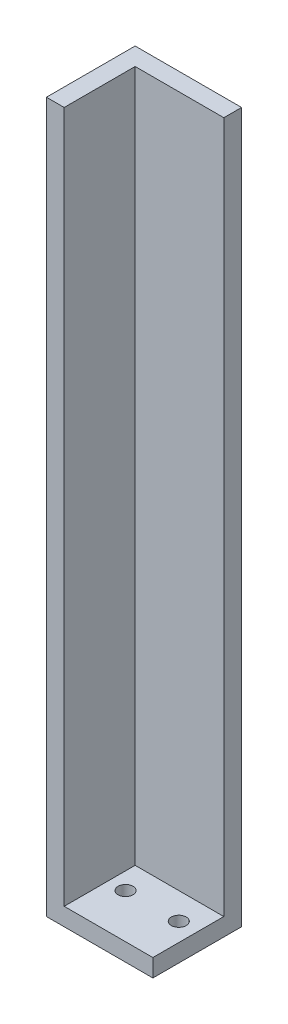
ISO-10303-21;
HEADER;
FILE_DESCRIPTION(('STEP AP214'),'2;1');
FILE_NAME('part.step','',(''),(''),'','','');
FILE_SCHEMA(('AUTOMOTIVE_DESIGN { 1 0 10303 214 1 1 1 1 }'));
ENDSEC;
DATA;
#1=APPLICATION_CONTEXT('core data for automotive mechanical design processes');
#2=APPLICATION_PROTOCOL_DEFINITION('international standard','automotive_design',2000,#1);
#3=PRODUCT_CONTEXT('',#1,'mechanical');
#4=PRODUCT('Part','Part','',(#3));
#5=PRODUCT_RELATED_PRODUCT_CATEGORY('part','',(#4));
#6=PRODUCT_DEFINITION_FORMATION('','',#4);
#7=PRODUCT_DEFINITION_CONTEXT('part definition',#1,'design');
#8=PRODUCT_DEFINITION('design','',#6,#7);
#9=PRODUCT_DEFINITION_SHAPE('','',#8);
#10=(LENGTH_UNIT() NAMED_UNIT(*) SI_UNIT(.MILLI.,.METRE.));
#11=(NAMED_UNIT(*) PLANE_ANGLE_UNIT() SI_UNIT($,.RADIAN.));
#12=(NAMED_UNIT(*) SI_UNIT($,.STERADIAN.) SOLID_ANGLE_UNIT());
#13=UNCERTAINTY_MEASURE_WITH_UNIT(LENGTH_MEASURE(1.E-05),#10,'distance_accuracy_value','');
#14=(GEOMETRIC_REPRESENTATION_CONTEXT(3) GLOBAL_UNCERTAINTY_ASSIGNED_CONTEXT((#13)) GLOBAL_UNIT_ASSIGNED_CONTEXT((#10,
#11,#12)) REPRESENTATION_CONTEXT('',''));
#15=CARTESIAN_POINT('',(0.,0.,0.));
#16=DIRECTION('',(0.,0.,1.));
#17=DIRECTION('',(1.,0.,0.));
#18=AXIS2_PLACEMENT_3D('',#15,#16,#17);
#19=CARTESIAN_POINT('',(30.,200.,25.));
#20=DIRECTION('',(-1.,0.,0.));
#21=DIRECTION('',(0.,0.,1.));
#22=AXIS2_PLACEMENT_3D('',#19,#20,#21);
#23=PLANE('',#22);
#24=DIRECTION('',(0.,1.,0.));
#25=VECTOR('',#24,1.);
#26=CARTESIAN_POINT('',(30.,200.,-15.));
#27=LINE('',#26,#25);
#28=CARTESIAN_POINT('',(30.,-190.,-15.));
#29=VERTEX_POINT('',#28);
#30=CARTESIAN_POINT('',(30.,200.,-15.));
#31=VERTEX_POINT('',#30);
#32=EDGE_CURVE('E51',#29,#31,#27,.T.);
#33=ORIENTED_EDGE('',*,*,#32,.F.);
#34=DIRECTION('',(0.,0.,-1.));
#35=VECTOR('',#34,1.);
#36=CARTESIAN_POINT('',(30.,-190.,25.));
#37=LINE('',#36,#35);
#38=CARTESIAN_POINT('',(30.,-190.,25.));
#39=VERTEX_POINT('',#38);
#40=EDGE_CURVE('E118',#39,#29,#37,.T.);
#41=ORIENTED_EDGE('',*,*,#40,.F.);
#42=DIRECTION('',(0.,-1.,0.));
#43=VECTOR('',#42,1.);
#44=CARTESIAN_POINT('',(30.,200.,25.));
#45=LINE('',#44,#43);
#46=CARTESIAN_POINT('',(30.,-200.,25.));
#47=VERTEX_POINT('',#46);
#48=EDGE_CURVE('E81',#39,#47,#45,.T.);
#49=ORIENTED_EDGE('',*,*,#48,.T.);
#50=DIRECTION('',(0.,0.,-1.));
#51=VECTOR('',#50,1.);
#52=CARTESIAN_POINT('',(30.,-200.,25.));
#53=LINE('',#52,#51);
#54=CARTESIAN_POINT('',(30.,-200.,-25.));
#55=VERTEX_POINT('',#54);
#56=EDGE_CURVE('E133',#47,#55,#53,.T.);
#57=ORIENTED_EDGE('',*,*,#56,.T.);
#58=DIRECTION('',(0.,-1.,0.));
#59=VECTOR('',#58,1.);
#60=CARTESIAN_POINT('',(30.,200.,-25.));
#61=LINE('',#60,#59);
#62=CARTESIAN_POINT('',(30.,200.,-25.));
#63=VERTEX_POINT('',#62);
#64=EDGE_CURVE('E12',#63,#55,#61,.T.);
#65=ORIENTED_EDGE('',*,*,#64,.F.);
#66=DIRECTION('',(0.,0.,-1.));
#67=VECTOR('',#66,1.);
#68=CARTESIAN_POINT('',(30.,200.,25.));
#69=LINE('',#68,#67);
#70=EDGE_CURVE('E86',#31,#63,#69,.T.);
#71=ORIENTED_EDGE('',*,*,#70,.F.);
#72=EDGE_LOOP('',(#33,#41,#49,#57,#65,#71));
#73=FACE_BOUND('',#72,.T.);
#74=ADVANCED_FACE('F35',(#73),#23,.F.);
#75=CARTESIAN_POINT('',(30.,200.,-25.));
#76=DIRECTION('',(0.,0.,1.));
#77=DIRECTION('',(1.,0.,0.));
#78=AXIS2_PLACEMENT_3D('',#75,#76,#77);
#79=PLANE('',#78);
#80=DIRECTION('',(-1.,0.,0.));
#81=VECTOR('',#80,1.);
#82=CARTESIAN_POINT('',(30.,-200.,-25.));
#83=LINE('',#82,#81);
#84=CARTESIAN_POINT('',(-30.,-200.,-25.));
#85=VERTEX_POINT('',#84);
#86=EDGE_CURVE('E143',#55,#85,#83,.T.);
#87=ORIENTED_EDGE('',*,*,#86,.T.);
#88=DIRECTION('',(0.,-1.,0.));
#89=VECTOR('',#88,1.);
#90=CARTESIAN_POINT('',(-30.,200.,-25.));
#91=LINE('',#90,#89);
#92=CARTESIAN_POINT('',(-30.,200.,-25.));
#93=VERTEX_POINT('',#92);
#94=EDGE_CURVE('E43',#93,#85,#91,.T.);
#95=ORIENTED_EDGE('',*,*,#94,.F.);
#96=DIRECTION('',(-1.,0.,0.));
#97=VECTOR('',#96,1.);
#98=CARTESIAN_POINT('',(30.,200.,-25.));
#99=LINE('',#98,#97);
#100=EDGE_CURVE('E135',#63,#93,#99,.T.);
#101=ORIENTED_EDGE('',*,*,#100,.F.);
#102=ORIENTED_EDGE('',*,*,#64,.T.);
#103=EDGE_LOOP('',(#87,#95,#101,#102));
#104=FACE_BOUND('',#103,.T.);
#105=ADVANCED_FACE('F187',(#104),#79,.F.);
#106=CARTESIAN_POINT('',(-30.,200.,25.));
#107=DIRECTION('',(-1.,0.,0.));
#108=DIRECTION('',(0.,0.,1.));
#109=AXIS2_PLACEMENT_3D('',#106,#107,#108);
#110=PLANE('',#109);
#111=DIRECTION('',(0.,0.,-1.));
#112=VECTOR('',#111,1.);
#113=CARTESIAN_POINT('',(-30.,-200.,25.));
#114=LINE('',#113,#112);
#115=CARTESIAN_POINT('',(-30.,-200.,25.));
#116=VERTEX_POINT('',#115);
#117=EDGE_CURVE('E146',#116,#85,#114,.T.);
#118=ORIENTED_EDGE('',*,*,#117,.F.);
#119=DIRECTION('',(0.,-1.,0.));
#120=VECTOR('',#119,1.);
#121=CARTESIAN_POINT('',(-30.,200.,25.));
#122=LINE('',#121,#120);
#123=CARTESIAN_POINT('',(-30.,200.,25.));
#124=VERTEX_POINT('',#123);
#125=EDGE_CURVE('E152',#124,#116,#122,.T.);
#126=ORIENTED_EDGE('',*,*,#125,.F.);
#127=DIRECTION('',(0.,0.,-1.));
#128=VECTOR('',#127,1.);
#129=CARTESIAN_POINT('',(-30.,200.,25.));
#130=LINE('',#129,#128);
#131=EDGE_CURVE('E138',#124,#93,#130,.T.);
#132=ORIENTED_EDGE('',*,*,#131,.T.);
#133=ORIENTED_EDGE('',*,*,#94,.T.);
#134=EDGE_LOOP('',(#118,#126,#132,#133));
#135=FACE_BOUND('',#134,.T.);
#136=ADVANCED_FACE('F184',(#135),#110,.T.);
#137=CARTESIAN_POINT('',(30.,200.,25.));
#138=DIRECTION('',(0.,0.,1.));
#139=DIRECTION('',(1.,0.,0.));
#140=AXIS2_PLACEMENT_3D('',#137,#138,#139);
#141=PLANE('',#140);
#142=DIRECTION('',(0.,-1.,0.));
#143=VECTOR('',#142,1.);
#144=CARTESIAN_POINT('',(-20.,200.,25.));
#145=LINE('',#144,#143);
#146=CARTESIAN_POINT('',(-20.,200.,25.));
#147=VERTEX_POINT('',#146);
#148=CARTESIAN_POINT('',(-20.,-190.,25.));
#149=VERTEX_POINT('',#148);
#150=EDGE_CURVE('E121',#147,#149,#145,.T.);
#151=ORIENTED_EDGE('',*,*,#150,.F.);
#152=DIRECTION('',(-1.,0.,0.));
#153=VECTOR('',#152,1.);
#154=CARTESIAN_POINT('',(30.,200.,25.));
#155=LINE('',#154,#153);
#156=EDGE_CURVE('E60',#147,#124,#155,.T.);
#157=ORIENTED_EDGE('',*,*,#156,.T.);
#158=ORIENTED_EDGE('',*,*,#125,.T.);
#159=DIRECTION('',(-1.,0.,0.));
#160=VECTOR('',#159,1.);
#161=CARTESIAN_POINT('',(30.,-200.,25.));
#162=LINE('',#161,#160);
#163=EDGE_CURVE('E136',#47,#116,#162,.T.);
#164=ORIENTED_EDGE('',*,*,#163,.F.);
#165=ORIENTED_EDGE('',*,*,#48,.F.);
#166=DIRECTION('',(1.,0.,0.));
#167=VECTOR('',#166,1.);
#168=CARTESIAN_POINT('',(-422.045915678253,-190.,25.));
#169=LINE('',#168,#167);
#170=EDGE_CURVE('E128',#149,#39,#169,.T.);
#171=ORIENTED_EDGE('',*,*,#170,.F.);
#172=EDGE_LOOP('',(#151,#157,#158,#164,#165,#171));
#173=FACE_BOUND('',#172,.T.);
#174=ADVANCED_FACE('F180',(#173),#141,.T.);
#175=CARTESIAN_POINT('',(0.,200.,0.));
#176=DIRECTION('',(0.,1.,0.));
#177=DIRECTION('',(0.,0.,1.));
#178=AXIS2_PLACEMENT_3D('',#175,#176,#177);
#179=PLANE('',#178);
#180=DIRECTION('',(0.,0.,1.));
#181=VECTOR('',#180,1.);
#182=CARTESIAN_POINT('',(-20.,200.,25.));
#183=LINE('',#182,#181);
#184=CARTESIAN_POINT('',(-20.,200.,-15.));
#185=VERTEX_POINT('',#184);
#186=EDGE_CURVE('E129',#185,#147,#183,.T.);
#187=ORIENTED_EDGE('',*,*,#186,.F.);
#188=DIRECTION('',(1.,0.,0.));
#189=VECTOR('',#188,1.);
#190=CARTESIAN_POINT('',(-422.045915678253,200.,-15.));
#191=LINE('',#190,#189);
#192=EDGE_CURVE('E109',#185,#31,#191,.T.);
#193=ORIENTED_EDGE('',*,*,#192,.T.);
#194=ORIENTED_EDGE('',*,*,#70,.T.);
#195=ORIENTED_EDGE('',*,*,#100,.T.);
#196=ORIENTED_EDGE('',*,*,#131,.F.);
#197=ORIENTED_EDGE('',*,*,#156,.F.);
#198=EDGE_LOOP('',(#187,#193,#194,#195,#196,#197));
#199=FACE_BOUND('',#198,.T.);
#200=ADVANCED_FACE('F175',(#199),#179,.T.);
#201=CARTESIAN_POINT('',(0.,-200.,0.));
#202=DIRECTION('',(0.,1.,0.));
#203=DIRECTION('',(0.,0.,1.));
#204=AXIS2_PLACEMENT_3D('',#201,#202,#203);
#205=PLANE('',#204);
#206=CARTESIAN_POINT('',(-10.3999999999996,-200.,2.43728648374741E-13));
#207=DIRECTION('',(0.,-1.,0.));
#208=DIRECTION('',(0.,0.,-1.));
#209=AXIS2_PLACEMENT_3D('',#206,#207,#208);
#210=CIRCLE('',#209,4.19999999989609);
#211=CARTESIAN_POINT('',(-10.3999999999996,-200.,-4.19999999989585));
#212=VERTEX_POINT('',#211);
#213=EDGE_CURVE('E156',#212,#212,#210,.T.);
#214=ORIENTED_EDGE('',*,*,#213,.F.);
#215=EDGE_LOOP('',(#214));
#216=FACE_BOUND('',#215,.T.);
#217=CARTESIAN_POINT('',(19.6000000000004,-200.,2.43728648374741E-13));
#218=DIRECTION('',(0.,-1.,0.));
#219=DIRECTION('',(0.,0.,-1.));
#220=AXIS2_PLACEMENT_3D('',#217,#218,#219);
#221=CIRCLE('',#220,4.19999999989609);
#222=CARTESIAN_POINT('',(19.6000000000004,-200.,-4.19999999989585));
#223=VERTEX_POINT('',#222);
#224=EDGE_CURVE('E161',#223,#223,#221,.T.);
#225=ORIENTED_EDGE('',*,*,#224,.F.);
#226=EDGE_LOOP('',(#225));
#227=FACE_BOUND('',#226,.T.);
#228=ORIENTED_EDGE('',*,*,#56,.F.);
#229=ORIENTED_EDGE('',*,*,#163,.T.);
#230=ORIENTED_EDGE('',*,*,#117,.T.);
#231=ORIENTED_EDGE('',*,*,#86,.F.);
#232=EDGE_LOOP('',(#228,#229,#230,#231));
#233=FACE_BOUND('',#232,.T.);
#234=ADVANCED_FACE('F172',(#216,#227,#233),#205,.F.);
#235=CARTESIAN_POINT('',(-20.,200.,25.));
#236=DIRECTION('',(-1.,0.,0.));
#237=DIRECTION('',(0.,0.,1.));
#238=AXIS2_PLACEMENT_3D('',#235,#236,#237);
#239=PLANE('',#238);
#240=ORIENTED_EDGE('',*,*,#150,.T.);
#241=DIRECTION('',(0.,0.,-1.));
#242=VECTOR('',#241,1.);
#243=CARTESIAN_POINT('',(-20.,-190.,25.));
#244=LINE('',#243,#242);
#245=CARTESIAN_POINT('',(-20.0000000000001,-190.,-15.));
#246=VERTEX_POINT('',#245);
#247=EDGE_CURVE('E116',#149,#246,#244,.T.);
#248=ORIENTED_EDGE('',*,*,#247,.T.);
#249=DIRECTION('',(0.,1.,0.));
#250=VECTOR('',#249,1.);
#251=CARTESIAN_POINT('',(-20.,200.,-15.));
#252=LINE('',#251,#250);
#253=EDGE_CURVE('E104',#246,#185,#252,.T.);
#254=ORIENTED_EDGE('',*,*,#253,.T.);
#255=ORIENTED_EDGE('',*,*,#186,.T.);
#256=EDGE_LOOP('',(#240,#248,#254,#255));
#257=FACE_BOUND('',#256,.T.);
#258=ADVANCED_FACE('F120',(#257),#239,.F.);
#259=CARTESIAN_POINT('',(-422.045915678253,-190.,25.));
#260=DIRECTION('',(0.,-1.,0.));
#261=DIRECTION('',(0.,0.,-1.));
#262=AXIS2_PLACEMENT_3D('',#259,#260,#261);
#263=PLANE('',#262);
#264=CARTESIAN_POINT('',(-10.3999999999996,-190.,2.43728648374741E-13));
#265=DIRECTION('',(0.,-1.,0.));
#266=DIRECTION('',(0.,0.,-1.));
#267=AXIS2_PLACEMENT_3D('',#264,#265,#266);
#268=CIRCLE('',#267,4.19999999989609);
#269=CARTESIAN_POINT('',(-10.3999999999996,-190.,-4.19999999989585));
#270=VERTEX_POINT('',#269);
#271=EDGE_CURVE('E38',#270,#270,#268,.T.);
#272=ORIENTED_EDGE('',*,*,#271,.T.);
#273=EDGE_LOOP('',(#272));
#274=FACE_BOUND('',#273,.T.);
#275=CARTESIAN_POINT('',(19.6000000000004,-190.,2.43728648374741E-13));
#276=DIRECTION('',(0.,-1.,0.));
#277=DIRECTION('',(0.,0.,-1.));
#278=AXIS2_PLACEMENT_3D('',#275,#276,#277);
#279=CIRCLE('',#278,4.19999999989609);
#280=CARTESIAN_POINT('',(19.6000000000004,-190.,-4.19999999989585));
#281=VERTEX_POINT('',#280);
#282=EDGE_CURVE('E154',#281,#281,#279,.T.);
#283=ORIENTED_EDGE('',*,*,#282,.T.);
#284=EDGE_LOOP('',(#283));
#285=FACE_BOUND('',#284,.T.);
#286=ORIENTED_EDGE('',*,*,#170,.T.);
#287=ORIENTED_EDGE('',*,*,#40,.T.);
#288=DIRECTION('',(1.,0.,0.));
#289=VECTOR('',#288,1.);
#290=CARTESIAN_POINT('',(-422.045915678253,-190.,-15.));
#291=LINE('',#290,#289);
#292=EDGE_CURVE('E107',#246,#29,#291,.T.);
#293=ORIENTED_EDGE('',*,*,#292,.F.);
#294=ORIENTED_EDGE('',*,*,#247,.F.);
#295=EDGE_LOOP('',(#286,#287,#293,#294));
#296=FACE_BOUND('',#295,.T.);
#297=ADVANCED_FACE('F115',(#274,#285,#296),#263,.F.);
#298=CARTESIAN_POINT('',(-422.045915678253,200.,-15.));
#299=DIRECTION('',(0.,0.,-1.));
#300=DIRECTION('',(0.,1.,0.));
#301=AXIS2_PLACEMENT_3D('',#298,#299,#300);
#302=PLANE('',#301);
#303=ORIENTED_EDGE('',*,*,#292,.T.);
#304=ORIENTED_EDGE('',*,*,#32,.T.);
#305=ORIENTED_EDGE('',*,*,#192,.F.);
#306=ORIENTED_EDGE('',*,*,#253,.F.);
#307=EDGE_LOOP('',(#303,#304,#305,#306));
#308=FACE_BOUND('',#307,.T.);
#309=ADVANCED_FACE('F106',(#308),#302,.F.);
#310=CARTESIAN_POINT('',(19.6000000000004,200.,2.43728648374741E-13));
#311=DIRECTION('',(0.,-1.,0.));
#312=DIRECTION('',(0.,0.,-1.));
#313=AXIS2_PLACEMENT_3D('',#310,#311,#312);
#314=CYLINDRICAL_SURFACE('',#313,4.19999999989609);
#315=ORIENTED_EDGE('',*,*,#224,.T.);
#316=EDGE_LOOP('',(#315));
#317=FACE_BOUND('',#316,.T.);
#318=ORIENTED_EDGE('',*,*,#282,.F.);
#319=EDGE_LOOP('',(#318));
#320=FACE_BOUND('',#319,.T.);
#321=ADVANCED_FACE('F169',(#317,#320),#314,.F.);
#322=CARTESIAN_POINT('',(-10.3999999999996,200.,2.43728648374741E-13));
#323=DIRECTION('',(0.,-1.,0.));
#324=DIRECTION('',(0.,0.,-1.));
#325=AXIS2_PLACEMENT_3D('',#322,#323,#324);
#326=CYLINDRICAL_SURFACE('',#325,4.19999999989609);
#327=ORIENTED_EDGE('',*,*,#213,.T.);
#328=EDGE_LOOP('',(#327));
#329=FACE_BOUND('',#328,.T.);
#330=ORIENTED_EDGE('',*,*,#271,.F.);
#331=EDGE_LOOP('',(#330));
#332=FACE_BOUND('',#331,.T.);
#333=ADVANCED_FACE('F210',(#329,#332),#326,.F.);
#334=CLOSED_SHELL('',(#74,#105,#136,#174,#200,#234,#258,#297,#309,#321,#333));
#335=MANIFOLD_SOLID_BREP('B2',#334);
#336=ADVANCED_BREP_SHAPE_REPRESENTATION('',(#18,#335),#14);
#337=SHAPE_DEFINITION_REPRESENTATION(#9,#336);
ENDSEC;
END-ISO-10303-21;
